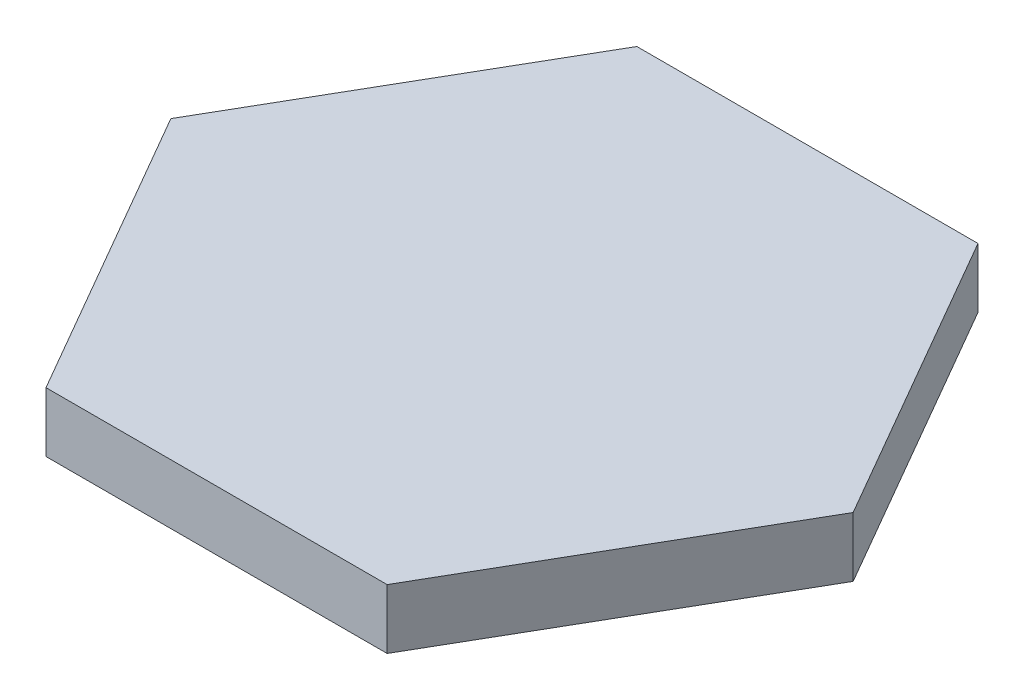
ISO-10303-21;
HEADER;
FILE_DESCRIPTION(('STEP AP214'),'2;1');
FILE_NAME('part.step','',(''),(''),'','','');
FILE_SCHEMA(('AUTOMOTIVE_DESIGN { 1 0 10303 214 1 1 1 1 }'));
ENDSEC;
DATA;
#1=APPLICATION_CONTEXT('core data for automotive mechanical design processes');
#2=APPLICATION_PROTOCOL_DEFINITION('international standard','automotive_design',2000,#1);
#3=PRODUCT_CONTEXT('',#1,'mechanical');
#4=PRODUCT('Part','Part','',(#3));
#5=PRODUCT_RELATED_PRODUCT_CATEGORY('part','',(#4));
#6=PRODUCT_DEFINITION_FORMATION('','',#4);
#7=PRODUCT_DEFINITION_CONTEXT('part definition',#1,'design');
#8=PRODUCT_DEFINITION('design','',#6,#7);
#9=PRODUCT_DEFINITION_SHAPE('','',#8);
#10=(LENGTH_UNIT() NAMED_UNIT(*) SI_UNIT(.MILLI.,.METRE.));
#11=(NAMED_UNIT(*) PLANE_ANGLE_UNIT() SI_UNIT($,.RADIAN.));
#12=(NAMED_UNIT(*) SI_UNIT($,.STERADIAN.) SOLID_ANGLE_UNIT());
#13=UNCERTAINTY_MEASURE_WITH_UNIT(LENGTH_MEASURE(1.E-05),#10,'distance_accuracy_value','');
#14=(GEOMETRIC_REPRESENTATION_CONTEXT(3) GLOBAL_UNCERTAINTY_ASSIGNED_CONTEXT((#13)) GLOBAL_UNIT_ASSIGNED_CONTEXT((#10,
#11,#12)) REPRESENTATION_CONTEXT('',''));
#15=CARTESIAN_POINT('',(0.,0.,0.));
#16=DIRECTION('',(0.,0.,1.));
#17=DIRECTION('',(1.,0.,0.));
#18=AXIS2_PLACEMENT_3D('',#15,#16,#17);
#19=CARTESIAN_POINT('',(22.8699988631395,8.,39.612));
#20=DIRECTION('',(-0.866025403784439,0.,-0.5));
#21=DIRECTION('',(-0.5,0.,0.866025403784439));
#22=AXIS2_PLACEMENT_3D('',#19,#20,#21);
#23=PLANE('',#22);
#24=DIRECTION('',(0.5,0.,-0.866025403784439));
#25=VECTOR('',#24,1.);
#26=CARTESIAN_POINT('',(22.8699988631395,0.,39.612));
#27=LINE('',#26,#25);
#28=CARTESIAN_POINT('',(22.8699988631395,0.,39.612));
#29=VERTEX_POINT('',#28);
#30=CARTESIAN_POINT('',(45.7399977262789,0.,0.));
#31=VERTEX_POINT('',#30);
#32=EDGE_CURVE('E116',#29,#31,#27,.T.);
#33=ORIENTED_EDGE('',*,*,#32,.T.);
#34=DIRECTION('',(0.,-1.,0.));
#35=VECTOR('',#34,1.);
#36=CARTESIAN_POINT('',(45.7399977262789,8.,0.));
#37=LINE('',#36,#35);
#38=CARTESIAN_POINT('',(45.7399977262789,8.,0.));
#39=VERTEX_POINT('',#38);
#40=EDGE_CURVE('E11',#39,#31,#37,.T.);
#41=ORIENTED_EDGE('',*,*,#40,.F.);
#42=DIRECTION('',(0.5,0.,-0.866025403784439));
#43=VECTOR('',#42,1.);
#44=CARTESIAN_POINT('',(22.8699988631395,8.,39.612));
#45=LINE('',#44,#43);
#46=CARTESIAN_POINT('',(22.8699988631395,8.,39.612));
#47=VERTEX_POINT('',#46);
#48=EDGE_CURVE('E126',#47,#39,#45,.T.);
#49=ORIENTED_EDGE('',*,*,#48,.F.);
#50=DIRECTION('',(0.,-1.,0.));
#51=VECTOR('',#50,1.);
#52=CARTESIAN_POINT('',(22.8699988631395,8.,39.612));
#53=LINE('',#52,#51);
#54=EDGE_CURVE('E112',#47,#29,#53,.T.);
#55=ORIENTED_EDGE('',*,*,#54,.T.);
#56=EDGE_LOOP('',(#33,#41,#49,#55));
#57=FACE_BOUND('',#56,.T.);
#58=ADVANCED_FACE('F32',(#57),#23,.F.);
#59=CARTESIAN_POINT('',(45.7399977262789,8.,0.));
#60=DIRECTION('',(-0.866025403784439,0.,0.5));
#61=DIRECTION('',(0.5,0.,0.866025403784439));
#62=AXIS2_PLACEMENT_3D('',#59,#60,#61);
#63=PLANE('',#62);
#64=DIRECTION('',(-0.5,0.,-0.866025403784439));
#65=VECTOR('',#64,1.);
#66=CARTESIAN_POINT('',(45.7399977262789,0.,0.));
#67=LINE('',#66,#65);
#68=CARTESIAN_POINT('',(22.8699988631394,0.,-39.612));
#69=VERTEX_POINT('',#68);
#70=EDGE_CURVE('E119',#31,#69,#67,.T.);
#71=ORIENTED_EDGE('',*,*,#70,.T.);
#72=DIRECTION('',(0.,-1.,0.));
#73=VECTOR('',#72,1.);
#74=CARTESIAN_POINT('',(22.8699988631394,8.,-39.612));
#75=LINE('',#74,#73);
#76=CARTESIAN_POINT('',(22.8699988631394,8.,-39.612));
#77=VERTEX_POINT('',#76);
#78=EDGE_CURVE('E40',#77,#69,#75,.T.);
#79=ORIENTED_EDGE('',*,*,#78,.F.);
#80=DIRECTION('',(-0.5,0.,-0.866025403784439));
#81=VECTOR('',#80,1.);
#82=CARTESIAN_POINT('',(45.7399977262789,8.,0.));
#83=LINE('',#82,#81);
#84=EDGE_CURVE('E85',#39,#77,#83,.T.);
#85=ORIENTED_EDGE('',*,*,#84,.F.);
#86=ORIENTED_EDGE('',*,*,#40,.T.);
#87=EDGE_LOOP('',(#71,#79,#85,#86));
#88=FACE_BOUND('',#87,.T.);
#89=ADVANCED_FACE('F150',(#88),#63,.F.);
#90=CARTESIAN_POINT('',(22.8699988631394,8.,-39.612));
#91=DIRECTION('',(0.,0.,1.));
#92=DIRECTION('',(1.,0.,0.));
#93=AXIS2_PLACEMENT_3D('',#90,#91,#92);
#94=PLANE('',#93);
#95=DIRECTION('',(-1.,0.,0.));
#96=VECTOR('',#95,1.);
#97=CARTESIAN_POINT('',(22.8699988631394,0.,-39.612));
#98=LINE('',#97,#96);
#99=CARTESIAN_POINT('',(-22.8699988631395,0.,-39.612));
#100=VERTEX_POINT('',#99);
#101=EDGE_CURVE('E121',#69,#100,#98,.T.);
#102=ORIENTED_EDGE('',*,*,#101,.T.);
#103=DIRECTION('',(0.,-1.,0.));
#104=VECTOR('',#103,1.);
#105=CARTESIAN_POINT('',(-22.8699988631395,8.,-39.612));
#106=LINE('',#105,#104);
#107=CARTESIAN_POINT('',(-22.8699988631395,8.,-39.612));
#108=VERTEX_POINT('',#107);
#109=EDGE_CURVE('E107',#108,#100,#106,.T.);
#110=ORIENTED_EDGE('',*,*,#109,.F.);
#111=DIRECTION('',(-1.,0.,0.));
#112=VECTOR('',#111,1.);
#113=CARTESIAN_POINT('',(22.8699988631394,8.,-39.612));
#114=LINE('',#113,#112);
#115=EDGE_CURVE('E98',#77,#108,#114,.T.);
#116=ORIENTED_EDGE('',*,*,#115,.F.);
#117=ORIENTED_EDGE('',*,*,#78,.T.);
#118=EDGE_LOOP('',(#102,#110,#116,#117));
#119=FACE_BOUND('',#118,.T.);
#120=ADVANCED_FACE('F132',(#119),#94,.F.);
#121=CARTESIAN_POINT('',(-22.8699988631395,8.,-39.612));
#122=DIRECTION('',(0.866025403784439,0.,0.5));
#123=DIRECTION('',(0.5,0.,-0.866025403784438));
#124=AXIS2_PLACEMENT_3D('',#121,#122,#123);
#125=PLANE('',#124);
#126=DIRECTION('',(-0.5,0.,0.866025403784438));
#127=VECTOR('',#126,1.);
#128=CARTESIAN_POINT('',(-22.8699988631395,0.,-39.612));
#129=LINE('',#128,#127);
#130=CARTESIAN_POINT('',(-45.7399977262789,0.,0.));
#131=VERTEX_POINT('',#130);
#132=EDGE_CURVE('E106',#100,#131,#129,.T.);
#133=ORIENTED_EDGE('',*,*,#132,.T.);
#134=DIRECTION('',(0.,-1.,0.));
#135=VECTOR('',#134,1.);
#136=CARTESIAN_POINT('',(-45.7399977262789,8.,0.));
#137=LINE('',#136,#135);
#138=CARTESIAN_POINT('',(-45.7399977262789,8.,0.));
#139=VERTEX_POINT('',#138);
#140=EDGE_CURVE('E103',#139,#131,#137,.T.);
#141=ORIENTED_EDGE('',*,*,#140,.F.);
#142=DIRECTION('',(-0.5,0.,0.866025403784438));
#143=VECTOR('',#142,1.);
#144=CARTESIAN_POINT('',(-22.8699988631395,8.,-39.612));
#145=LINE('',#144,#143);
#146=EDGE_CURVE('E92',#108,#139,#145,.T.);
#147=ORIENTED_EDGE('',*,*,#146,.F.);
#148=ORIENTED_EDGE('',*,*,#109,.T.);
#149=EDGE_LOOP('',(#133,#141,#147,#148));
#150=FACE_BOUND('',#149,.T.);
#151=ADVANCED_FACE('F104',(#150),#125,.F.);
#152=CARTESIAN_POINT('',(-45.7399977262789,8.,0.));
#153=DIRECTION('',(0.866025403784439,0.,-0.5));
#154=DIRECTION('',(-0.5,0.,-0.866025403784439));
#155=AXIS2_PLACEMENT_3D('',#152,#153,#154);
#156=PLANE('',#155);
#157=DIRECTION('',(0.5,0.,0.866025403784438));
#158=VECTOR('',#157,1.);
#159=CARTESIAN_POINT('',(-45.7399977262789,0.,0.));
#160=LINE('',#159,#158);
#161=CARTESIAN_POINT('',(-22.8699988631394,0.,39.612));
#162=VERTEX_POINT('',#161);
#163=EDGE_CURVE('E71',#131,#162,#160,.T.);
#164=ORIENTED_EDGE('',*,*,#163,.T.);
#165=DIRECTION('',(0.,-1.,0.));
#166=VECTOR('',#165,1.);
#167=CARTESIAN_POINT('',(-22.8699988631394,8.,39.612));
#168=LINE('',#167,#166);
#169=CARTESIAN_POINT('',(-22.8699988631394,8.,39.612));
#170=VERTEX_POINT('',#169);
#171=EDGE_CURVE('E108',#170,#162,#168,.T.);
#172=ORIENTED_EDGE('',*,*,#171,.F.);
#173=DIRECTION('',(0.5,0.,0.866025403784438));
#174=VECTOR('',#173,1.);
#175=CARTESIAN_POINT('',(-45.7399977262789,8.,0.));
#176=LINE('',#175,#174);
#177=EDGE_CURVE('E96',#139,#170,#176,.T.);
#178=ORIENTED_EDGE('',*,*,#177,.F.);
#179=ORIENTED_EDGE('',*,*,#140,.T.);
#180=EDGE_LOOP('',(#164,#172,#178,#179));
#181=FACE_BOUND('',#180,.T.);
#182=ADVANCED_FACE('F110',(#181),#156,.F.);
#183=CARTESIAN_POINT('',(-22.8699988631394,8.,39.612));
#184=DIRECTION('',(0.,0.,-1.));
#185=DIRECTION('',(-1.,0.,0.));
#186=AXIS2_PLACEMENT_3D('',#183,#184,#185);
#187=PLANE('',#186);
#188=DIRECTION('',(1.,0.,0.));
#189=VECTOR('',#188,1.);
#190=CARTESIAN_POINT('',(-22.8699988631394,0.,39.612));
#191=LINE('',#190,#189);
#192=EDGE_CURVE('E77',#162,#29,#191,.T.);
#193=ORIENTED_EDGE('',*,*,#192,.T.);
#194=ORIENTED_EDGE('',*,*,#54,.F.);
#195=DIRECTION('',(1.,0.,0.));
#196=VECTOR('',#195,1.);
#197=CARTESIAN_POINT('',(-22.8699988631394,8.,39.612));
#198=LINE('',#197,#196);
#199=EDGE_CURVE('E48',#170,#47,#198,.T.);
#200=ORIENTED_EDGE('',*,*,#199,.F.);
#201=ORIENTED_EDGE('',*,*,#171,.T.);
#202=EDGE_LOOP('',(#193,#194,#200,#201));
#203=FACE_BOUND('',#202,.T.);
#204=ADVANCED_FACE('F139',(#203),#187,.F.);
#205=CARTESIAN_POINT('',(0.,8.,0.));
#206=DIRECTION('',(0.,1.,0.));
#207=DIRECTION('',(0.,0.,1.));
#208=AXIS2_PLACEMENT_3D('',#205,#206,#207);
#209=PLANE('',#208);
#210=ORIENTED_EDGE('',*,*,#48,.T.);
#211=ORIENTED_EDGE('',*,*,#84,.T.);
#212=ORIENTED_EDGE('',*,*,#115,.T.);
#213=ORIENTED_EDGE('',*,*,#146,.T.);
#214=ORIENTED_EDGE('',*,*,#177,.T.);
#215=ORIENTED_EDGE('',*,*,#199,.T.);
#216=EDGE_LOOP('',(#210,#211,#212,#213,#214,#215));
#217=FACE_BOUND('',#216,.T.);
#218=ADVANCED_FACE('F94',(#217),#209,.T.);
#219=CARTESIAN_POINT('',(0.,0.,0.));
#220=DIRECTION('',(0.,1.,0.));
#221=DIRECTION('',(0.,0.,1.));
#222=AXIS2_PLACEMENT_3D('',#219,#220,#221);
#223=PLANE('',#222);
#224=ORIENTED_EDGE('',*,*,#32,.F.);
#225=ORIENTED_EDGE('',*,*,#192,.F.);
#226=ORIENTED_EDGE('',*,*,#163,.F.);
#227=ORIENTED_EDGE('',*,*,#132,.F.);
#228=ORIENTED_EDGE('',*,*,#101,.F.);
#229=ORIENTED_EDGE('',*,*,#70,.F.);
#230=EDGE_LOOP('',(#224,#225,#226,#227,#228,#229));
#231=FACE_BOUND('',#230,.T.);
#232=ADVANCED_FACE('F135',(#231),#223,.F.);
#233=CLOSED_SHELL('',(#58,#89,#120,#151,#182,#204,#218,#232));
#234=MANIFOLD_SOLID_BREP('B2',#233);
#235=ADVANCED_BREP_SHAPE_REPRESENTATION('',(#18,#234),#14);
#236=SHAPE_DEFINITION_REPRESENTATION(#9,#235);
ENDSEC;
END-ISO-10303-21;
